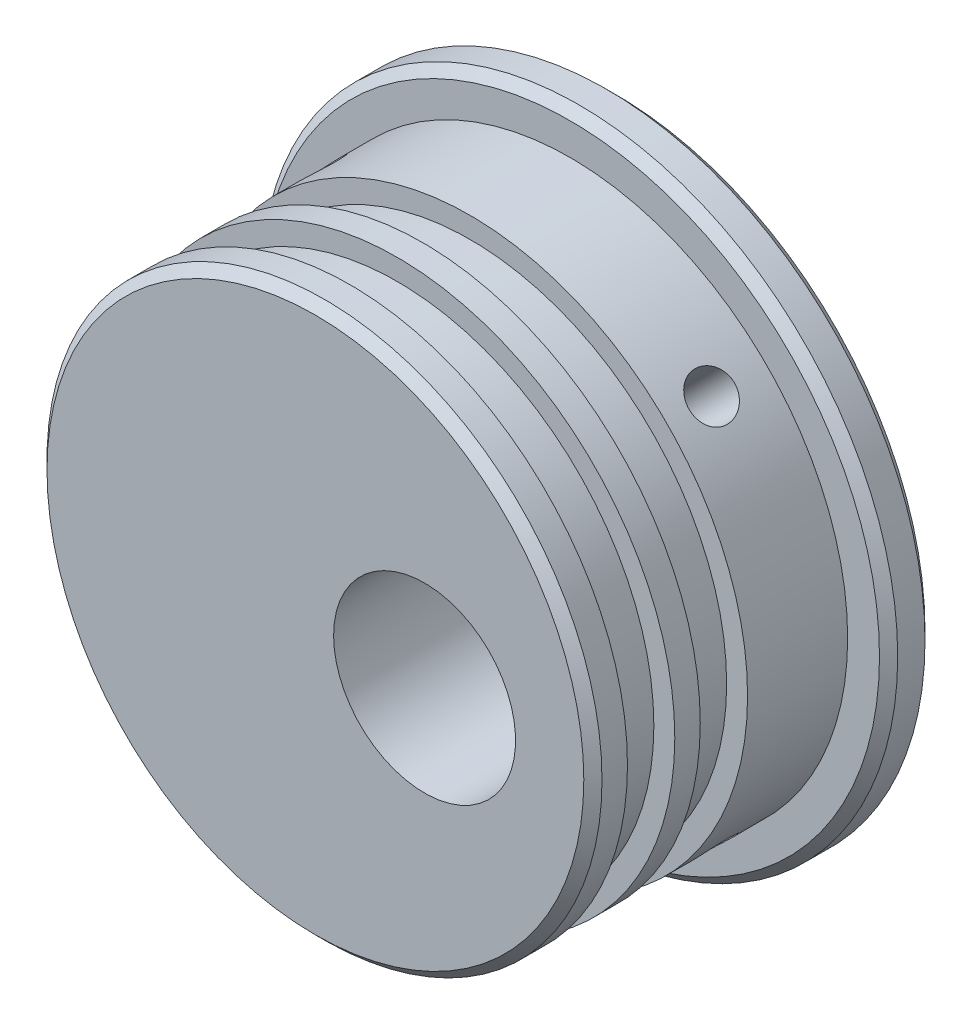
ISO-10303-21;
HEADER;
FILE_DESCRIPTION(('STEP AP214'),'2;1');
FILE_NAME('part.step','',(''),(''),'','','');
FILE_SCHEMA(('AUTOMOTIVE_DESIGN { 1 0 10303 214 1 1 1 1 }'));
ENDSEC;
DATA;
#1=APPLICATION_CONTEXT('core data for automotive mechanical design processes');
#2=APPLICATION_PROTOCOL_DEFINITION('international standard','automotive_design',2000,#1);
#3=PRODUCT_CONTEXT('',#1,'mechanical');
#4=PRODUCT('Part','Part','',(#3));
#5=PRODUCT_RELATED_PRODUCT_CATEGORY('part','',(#4));
#6=PRODUCT_DEFINITION_FORMATION('','',#4);
#7=PRODUCT_DEFINITION_CONTEXT('part definition',#1,'design');
#8=PRODUCT_DEFINITION('design','',#6,#7);
#9=PRODUCT_DEFINITION_SHAPE('','',#8);
#10=(LENGTH_UNIT() NAMED_UNIT(*) SI_UNIT(.MILLI.,.METRE.));
#11=(NAMED_UNIT(*) PLANE_ANGLE_UNIT() SI_UNIT($,.RADIAN.));
#12=(NAMED_UNIT(*) SI_UNIT($,.STERADIAN.) SOLID_ANGLE_UNIT());
#13=UNCERTAINTY_MEASURE_WITH_UNIT(LENGTH_MEASURE(1.E-05),#10,'distance_accuracy_value','');
#14=(GEOMETRIC_REPRESENTATION_CONTEXT(3) GLOBAL_UNCERTAINTY_ASSIGNED_CONTEXT((#13)) GLOBAL_UNIT_ASSIGNED_CONTEXT((#10,
#11,#12)) REPRESENTATION_CONTEXT('',''));
#15=CARTESIAN_POINT('',(0.,0.,0.));
#16=DIRECTION('',(0.,0.,1.));
#17=DIRECTION('',(1.,0.,0.));
#18=AXIS2_PLACEMENT_3D('',#15,#16,#17);
#19=CARTESIAN_POINT('',(0.,0.,14.));
#20=DIRECTION('',(0.,0.,-1.));
#21=DIRECTION('',(-1.,0.,0.));
#22=AXIS2_PLACEMENT_3D('',#19,#20,#21);
#23=CYLINDRICAL_SURFACE('',#22,15.25);
#24=CARTESIAN_POINT('',(0.,0.,0.));
#25=DIRECTION('',(0.,0.,1.));
#26=DIRECTION('',(1.,0.,0.));
#27=AXIS2_PLACEMENT_3D('',#24,#25,#26);
#28=CIRCLE('',#27,15.25);
#29=CARTESIAN_POINT('',(15.25,0.,0.));
#30=VERTEX_POINT('',#29);
#31=EDGE_CURVE('E140',#30,#30,#28,.T.);
#32=ORIENTED_EDGE('',*,*,#31,.T.);
#33=EDGE_LOOP('',(#32));
#34=FACE_BOUND('',#33,.T.);
#35=CARTESIAN_POINT('',(0.,0.,5.5));
#36=DIRECTION('',(0.,0.,1.));
#37=DIRECTION('',(1.,0.,0.));
#38=AXIS2_PLACEMENT_3D('',#35,#36,#37);
#39=CIRCLE('',#38,15.25);
#40=CARTESIAN_POINT('',(15.25,0.,5.5));
#41=VERTEX_POINT('',#40);
#42=EDGE_CURVE('E144',#41,#41,#39,.T.);
#43=ORIENTED_EDGE('',*,*,#42,.F.);
#44=EDGE_LOOP('',(#43));
#45=FACE_BOUND('',#44,.T.);
#46=CARTESIAN_POINT('',(11.6309761065855,9.86320915361913,3.));
#47=CARTESIAN_POINT('',(11.6309744215201,9.86321180087857,2.92991360305348));
#48=CARTESIAN_POINT('',(11.6271405155153,9.86773772011875,2.85977939119693));
#49=CARTESIAN_POINT('',(11.6118741063526,9.88569741000501,2.72145119558452));
#50=CARTESIAN_POINT('',(11.6004329758878,9.89914129442054,2.65325950650436));
#51=CARTESIAN_POINT('',(11.5702000278005,9.93446065307875,2.52083985247226));
#52=CARTESIAN_POINT('',(11.5514123560731,9.95633137167976,2.45660967553571));
#53=CARTESIAN_POINT('',(11.5068971891931,10.0077453892855,2.33390211116577));
#54=CARTESIAN_POINT('',(11.4811711854819,10.0372870393211,2.27542349107885));
#55=CARTESIAN_POINT('',(11.4232797989768,10.1031232118335,2.1657181334001));
#56=CARTESIAN_POINT('',(11.3911003383923,10.1394324849916,2.11450767533015));
#57=CARTESIAN_POINT('',(11.321068820752,10.217565625985,2.02093214410294));
#58=CARTESIAN_POINT('',(11.2832165168327,10.2593897337981,1.97856745607637));
#59=CARTESIAN_POINT('',(11.2026811307694,10.3472695532697,1.90383210916556));
#60=CARTESIAN_POINT('',(11.1599913699655,10.3933310982818,1.8714755030423));
#61=CARTESIAN_POINT('',(11.0708908105767,10.4881889008943,1.81776469729084));
#62=CARTESIAN_POINT('',(11.024480075253,10.5369851119977,1.7964103106572));
#63=CARTESIAN_POINT('',(10.9292665051706,10.6357098302593,1.76535688775954));
#64=CARTESIAN_POINT('',(10.8804693279507,10.6856355217365,1.75563155574531));
#65=CARTESIAN_POINT('',(10.7817296765861,10.7852548717217,1.74803102562128));
#66=CARTESIAN_POINT('',(10.7317872231334,10.8349485344024,1.7501556135834));
#67=CARTESIAN_POINT('',(10.6323124276236,10.9325787972126,1.76617309559805));
#68=CARTESIAN_POINT('',(10.5827793886565,10.98051933083,1.78003771196652));
#69=CARTESIAN_POINT('',(10.4854708907786,11.0734787231221,1.81909772239888));
#70=CARTESIAN_POINT('',(10.4376954481331,11.1184975547612,1.84429322129421));
#71=CARTESIAN_POINT('',(10.3453078042328,11.2045124534979,1.90533134267823));
#72=CARTESIAN_POINT('',(10.3006994476219,11.2455036537089,1.94118664069611));
#73=CARTESIAN_POINT('',(10.2161117146463,11.3224040856958,2.02251735536991));
#74=CARTESIAN_POINT('',(10.1761324290984,11.3583132177706,2.06799296071533));
#75=CARTESIAN_POINT('',(10.1019847087802,11.4243109813386,2.16743280398354));
#76=CARTESIAN_POINT('',(10.0678337078505,11.4543821858119,2.22142161136147));
#77=CARTESIAN_POINT('',(10.0066246508903,11.5078938687928,2.33626965687285));
#78=CARTESIAN_POINT('',(9.9795666004347,11.5313343420889,2.39712890040615));
#79=CARTESIAN_POINT('',(9.93346533584459,11.5710715738726,2.52400743401802));
#80=CARTESIAN_POINT('',(9.91442306490565,11.5873674916886,2.59002733025384));
#81=CARTESIAN_POINT('',(9.88502421569937,11.612457666923,2.7253449290061));
#82=CARTESIAN_POINT('',(9.87466746084485,11.6212520768564,2.79464256485182));
#83=CARTESIAN_POINT('',(9.86302388392707,11.6311357655158,2.93433288586504));
#84=CARTESIAN_POINT('',(9.86171078357702,11.6322473683266,3.00472180219505));
#85=CARTESIAN_POINT('',(9.86813147318954,11.6268008609479,3.14478606317713));
#86=CARTESIAN_POINT('',(9.87586518155354,11.6202428199356,3.21446141425955));
#87=CARTESIAN_POINT('',(9.9000883519537,11.5996120859186,3.35102216448946));
#88=CARTESIAN_POINT('',(9.91656561995631,11.5855498583262,3.41791130959227));
#89=CARTESIAN_POINT('',(9.95769416637095,11.5502189413429,3.54711691691239));
#90=CARTESIAN_POINT('',(9.9823455717449,11.5289501400183,3.60943330808664));
#91=CARTESIAN_POINT('',(10.039046401265,11.4796105156591,3.72788178439302));
#92=CARTESIAN_POINT('',(10.0711127019415,11.4515241683156,3.78399932352413));
#93=CARTESIAN_POINT('',(10.1415396401307,11.3892001043952,3.88831014655002));
#94=CARTESIAN_POINT('',(10.1799003824625,11.354962285379,3.93650329845584));
#95=CARTESIAN_POINT('',(10.2617643849538,11.2810343024912,4.02371453600203));
#96=CARTESIAN_POINT('',(10.3052797792833,11.2413312362467,4.06271029906659));
#97=CARTESIAN_POINT('',(10.3959892271028,11.1574959992806,4.13026667968633));
#98=CARTESIAN_POINT('',(10.4431832448559,11.1133638715852,4.15882739860038));
#99=CARTESIAN_POINT('',(10.5397227948961,11.0218491190926,4.20466458427029));
#100=CARTESIAN_POINT('',(10.5890656111406,10.9744705566265,4.22195487894049));
#101=CARTESIAN_POINT('',(10.6884685778403,10.8776812558851,4.24480560667045));
#102=CARTESIAN_POINT('',(10.7385287151862,10.8282705547171,4.25036625381923));
#103=CARTESIAN_POINT('',(10.8377623151394,10.7289478515367,4.2495973777545));
#104=CARTESIAN_POINT('',(10.8869379463828,10.6790377431088,4.24330265380566));
#105=CARTESIAN_POINT('',(10.9831868410489,10.5800224850005,4.21907425726429));
#106=CARTESIAN_POINT('',(11.0302601015411,10.5309173364421,4.20114056844852));
#107=CARTESIAN_POINT('',(11.1210549230309,10.4349893380085,4.1541520931392));
#108=CARTESIAN_POINT('',(11.1647766628317,10.388166366428,4.12509790041974));
#109=CARTESIAN_POINT('',(11.2477712151842,10.2982469915684,4.05669718835404));
#110=CARTESIAN_POINT('',(11.2870441013903,10.2551505265966,4.01735083943888));
#111=CARTESIAN_POINT('',(11.3603056880614,10.173935296532,3.92935214954373));
#112=CARTESIAN_POINT('',(11.3942792979223,10.135830794534,3.8806740817463));
#113=CARTESIAN_POINT('',(11.4560350430458,10.0659793848153,3.77543969842741));
#114=CARTESIAN_POINT('',(11.4838156757412,10.0342340201651,3.71888147638586));
#115=CARTESIAN_POINT('',(11.5326000250834,9.97812736744317,3.59938589608275));
#116=CARTESIAN_POINT('',(11.5535912772128,9.95377966553389,3.53643708057574));
#117=CARTESIAN_POINT('',(11.5882497728167,9.91340918544415,3.40607366549575));
#118=CARTESIAN_POINT('',(11.6019254487227,9.89737682308845,3.33866430864196));
#119=CARTESIAN_POINT('',(11.6181791134704,9.8782844889429,3.22571344742056));
#120=CARTESIAN_POINT('',(11.6229730126722,9.8726401307849,3.18089867495409));
#121=CARTESIAN_POINT('',(11.6293720505741,9.86510161103692,3.09072928111191));
#122=CARTESIAN_POINT('',(11.6309771975144,9.86320743975589,3.04537466113155));
#123=CARTESIAN_POINT('',(11.6309761065855,9.86320915361913,3.));
#124=B_SPLINE_CURVE_WITH_KNOTS('',3,(#46,#47,#48,#49,#50,#51,#52,#53,#54,#55,#56,#57,#58,#59,
#60,#61,#62,#63,#64,#65,#66,#67,#68,#69,#70,#71,#72,#73,#74,#75,#76,#77,#78,#79,#80,#81,#82,#83,
#84,#85,#86,#87,#88,#89,#90,#91,#92,#93,#94,#95,#96,#97,#98,#99,#100,#101,#102,#103,#104,#105,
#106,#107,#108,#109,#110,#111,#112,#113,#114,#115,#116,#117,#118,#119,#120,#121,#122,#123),
.UNSPECIFIED.,.T.,.F.,(4,2,2,2,2,2,2,2,2,2,2,2,2,2,2,2,2,2,2,2,2,2,2,2,2,2,2,2,2,2,2,2,2,2,2,2,
2,2,4),(0.,0.21009352132337,0.420425715756466,0.630639383716231,0.840807900796242,
1.05143997368959,1.26208121525537,1.47301689808562,1.68394899551014,1.89440322343687,
2.10485365201923,2.31479861521414,2.52474552082472,2.7349430789113,2.94514476012483,
3.1559645863687,3.36678457830843,3.57762936994871,3.78846987475218,3.99869747759377,
4.20892318428145,4.41885647140858,4.62879301940303,4.83921217629779,5.04963483758905,
5.26056306858212,5.4714892507083,5.68215615362665,5.89281921142861,6.10286487007458,
6.31291082149818,6.52294555918085,6.73297681905194,6.94359566979171,7.15426556631034,
7.36532006153524,7.57613075388127,7.71214783260012,7.84816455982973),.UNSPECIFIED.);
#125=CARTESIAN_POINT('',(11.6309761065855,9.86320915361913,3.));
#126=VERTEX_POINT('',#125);
#127=EDGE_CURVE('E66',#126,#126,#124,.T.);
#128=ORIENTED_EDGE('',*,*,#127,.F.);
#129=EDGE_LOOP('',(#128));
#130=FACE_BOUND('',#129,.T.);
#131=CARTESIAN_POINT('',(9.86320915361925,-11.6309761065854,3.));
#132=CARTESIAN_POINT('',(9.86321180087869,-11.63097442152,2.92991360305348));
#133=CARTESIAN_POINT('',(9.86773772011887,-11.6271405155152,2.85977939119693));
#134=CARTESIAN_POINT('',(9.88569741000513,-11.6118741063525,2.72145119558452));
#135=CARTESIAN_POINT('',(9.89914129442066,-11.6004329758877,2.65325950650436));
#136=CARTESIAN_POINT('',(9.93446065307887,-11.5702000278004,2.52083985247226));
#137=CARTESIAN_POINT('',(9.95633137167988,-11.551412356073,2.45660967553571));
#138=CARTESIAN_POINT('',(10.0077453892856,-11.506897189193,2.33390211116577));
#139=CARTESIAN_POINT('',(10.0372870393212,-11.4811711854818,2.27542349107885));
#140=CARTESIAN_POINT('',(10.1031232118336,-11.4232797989767,2.1657181334001));
#141=CARTESIAN_POINT('',(10.1394324849917,-11.3911003383922,2.11450767533015));
#142=CARTESIAN_POINT('',(10.2175656259852,-11.3210688207519,2.02093214410294));
#143=CARTESIAN_POINT('',(10.2593897337982,-11.2832165168326,1.97856745607637));
#144=CARTESIAN_POINT('',(10.3472695532699,-11.2026811307693,1.90383210916556));
#145=CARTESIAN_POINT('',(10.393331098282,-11.1599913699654,1.8714755030423));
#146=CARTESIAN_POINT('',(10.4881889008944,-11.0708908105766,1.81776469729084));
#147=CARTESIAN_POINT('',(10.5369851119978,-11.0244800752529,1.7964103106572));
#148=CARTESIAN_POINT('',(10.6357098302594,-10.9292665051705,1.76535688775954));
#149=CARTESIAN_POINT('',(10.6856355217366,-10.8804693279506,1.75563155574531));
#150=CARTESIAN_POINT('',(10.7852548717219,-10.781729676586,1.74803102562128));
#151=CARTESIAN_POINT('',(10.8349485344025,-10.7317872231333,1.7501556135834));
#152=CARTESIAN_POINT('',(10.9325787972127,-10.6323124276234,1.76617309559805));
#153=CARTESIAN_POINT('',(10.9805193308301,-10.5827793886564,1.78003771196652));
#154=CARTESIAN_POINT('',(11.0734787231222,-10.4854708907785,1.81909772239888));
#155=CARTESIAN_POINT('',(11.1184975547613,-10.437695448133,1.84429322129421));
#156=CARTESIAN_POINT('',(11.204512453498,-10.3453078042327,1.90533134267823));
#157=CARTESIAN_POINT('',(11.245503653709,-10.3006994476218,1.94118664069611));
#158=CARTESIAN_POINT('',(11.3224040856959,-10.2161117146462,2.02251735536991));
#159=CARTESIAN_POINT('',(11.3583132177707,-10.1761324290983,2.06799296071533));
#160=CARTESIAN_POINT('',(11.4243109813387,-10.10198470878,2.16743280398354));
#161=CARTESIAN_POINT('',(11.454382185812,-10.0678337078503,2.22142161136147));
#162=CARTESIAN_POINT('',(11.5078938687929,-10.0066246508902,2.33626965687285));
#163=CARTESIAN_POINT('',(11.531334342089,-9.97956660043458,2.39712890040615));
#164=CARTESIAN_POINT('',(11.5710715738727,-9.93346533584447,2.52400743401802));
#165=CARTESIAN_POINT('',(11.5873674916887,-9.91442306490552,2.59002733025384));
#166=CARTESIAN_POINT('',(11.6124576669231,-9.88502421569925,2.7253449290061));
#167=CARTESIAN_POINT('',(11.6212520768565,-9.87466746084473,2.79464256485182));
#168=CARTESIAN_POINT('',(11.6311357655159,-9.86302388392695,2.93433288586504));
#169=CARTESIAN_POINT('',(11.6322473683267,-9.86171078357689,3.00472180219505));
#170=CARTESIAN_POINT('',(11.626800860948,-9.86813147318941,3.14478606317713));
#171=CARTESIAN_POINT('',(11.6202428199357,-9.87586518155341,3.21446141425955));
#172=CARTESIAN_POINT('',(11.5996120859187,-9.90008835195358,3.35102216448946));
#173=CARTESIAN_POINT('',(11.5855498583263,-9.91656561995619,3.41791130959227));
#174=CARTESIAN_POINT('',(11.550218941343,-9.95769416637083,3.54711691691239));
#175=CARTESIAN_POINT('',(11.5289501400184,-9.98234557174477,3.60943330808664));
#176=CARTESIAN_POINT('',(11.4796105156592,-10.0390464012649,3.72788178439302));
#177=CARTESIAN_POINT('',(11.4515241683157,-10.0711127019414,3.78399932352413));
#178=CARTESIAN_POINT('',(11.3892001043953,-10.1415396401305,3.88831014655002));
#179=CARTESIAN_POINT('',(11.3549622853792,-10.1799003824624,3.93650329845584));
#180=CARTESIAN_POINT('',(11.2810343024913,-10.2617643849537,4.02371453600203));
#181=CARTESIAN_POINT('',(11.2413312362468,-10.3052797792832,4.06271029906659));
#182=CARTESIAN_POINT('',(11.1574959992807,-10.3959892271027,4.13026667968633));
#183=CARTESIAN_POINT('',(11.1133638715853,-10.4431832448558,4.15882739860039));
#184=CARTESIAN_POINT('',(11.0218491190927,-10.539722794896,4.20466458427029));
#185=CARTESIAN_POINT('',(10.9744705566266,-10.5890656111405,4.22195487894049));
#186=CARTESIAN_POINT('',(10.8776812558852,-10.6884685778402,4.24480560667045));
#187=CARTESIAN_POINT('',(10.8282705547172,-10.7385287151861,4.25036625381923));
#188=CARTESIAN_POINT('',(10.7289478515368,-10.8377623151392,4.2495973777545));
#189=CARTESIAN_POINT('',(10.679037743109,-10.8869379463827,4.24330265380566));
#190=CARTESIAN_POINT('',(10.5800224850006,-10.9831868410488,4.21907425726429));
#191=CARTESIAN_POINT('',(10.5309173364422,-11.030260101541,4.20114056844852));
#192=CARTESIAN_POINT('',(10.4349893380087,-11.1210549230307,4.1541520931392));
#193=CARTESIAN_POINT('',(10.3881663664282,-11.1647766628316,4.12509790041974));
#194=CARTESIAN_POINT('',(10.2982469915685,-11.2477712151841,4.05669718835404));
#195=CARTESIAN_POINT('',(10.2551505265967,-11.2870441013901,4.01735083943888));
#196=CARTESIAN_POINT('',(10.1739352965321,-11.3603056880613,3.92935214954373));
#197=CARTESIAN_POINT('',(10.1358307945341,-11.3942792979222,3.8806740817463));
#198=CARTESIAN_POINT('',(10.0659793848154,-11.4560350430457,3.77543969842741));
#199=CARTESIAN_POINT('',(10.0342340201652,-11.4838156757411,3.71888147638586));
#200=CARTESIAN_POINT('',(9.97812736744329,-11.5326000250833,3.59938589608275));
#201=CARTESIAN_POINT('',(9.95377966553401,-11.5535912772127,3.53643708057574));
#202=CARTESIAN_POINT('',(9.91340918544427,-11.5882497728166,3.40607366549575));
#203=CARTESIAN_POINT('',(9.89737682308858,-11.6019254487226,3.33866430864196));
#204=CARTESIAN_POINT('',(9.87828448894303,-11.6181791134703,3.22571344742056));
#205=CARTESIAN_POINT('',(9.87264013078502,-11.6229730126721,3.18089867495409));
#206=CARTESIAN_POINT('',(9.86510161103704,-11.629372050574,3.09072928111191));
#207=CARTESIAN_POINT('',(9.86320743975601,-11.6309771975143,3.04537466113155));
#208=CARTESIAN_POINT('',(9.86320915361925,-11.6309761065854,3.));
#209=B_SPLINE_CURVE_WITH_KNOTS('',3,(#131,#132,#133,#134,#135,#136,#137,#138,#139,#140,#141,
#142,#143,#144,#145,#146,#147,#148,#149,#150,#151,#152,#153,#154,#155,#156,#157,#158,#159,#160,
#161,#162,#163,#164,#165,#166,#167,#168,#169,#170,#171,#172,#173,#174,#175,#176,#177,#178,#179,
#180,#181,#182,#183,#184,#185,#186,#187,#188,#189,#190,#191,#192,#193,#194,#195,#196,#197,#198,
#199,#200,#201,#202,#203,#204,#205,#206,#207,#208),.UNSPECIFIED.,.T.,.F.,(4,2,2,2,2,2,2,2,2,2,2,
2,2,2,2,2,2,2,2,2,2,2,2,2,2,2,2,2,2,2,2,2,2,2,2,2,2,2,4),(0.,0.21009352132337,0.420425715756466,
0.630639383716232,0.840807900796242,1.05143997368959,1.26208121525537,1.47301689808563,
1.68394899551014,1.89440322343688,2.10485365201923,2.31479861521414,2.52474552082472,
2.7349430789113,2.94514476012483,3.1559645863687,3.36678457830843,3.57762936994872,
3.78846987475219,3.99869747759377,4.20892318428145,4.41885647140858,4.62879301940303,
4.8392121762978,5.04963483758905,5.26056306858212,5.4714892507083,5.68215615362665,
5.89281921142862,6.10286487007458,6.31291082149818,6.52294555918085,6.73297681905195,
6.94359566979172,7.15426556631035,7.36532006153524,7.57613075388127,7.71214783260012,
7.84816455982974),.UNSPECIFIED.);
#210=CARTESIAN_POINT('',(9.86320915361925,-11.6309761065854,3.));
#211=VERTEX_POINT('',#210);
#212=EDGE_CURVE('E75',#211,#211,#209,.T.);
#213=ORIENTED_EDGE('',*,*,#212,.F.);
#214=EDGE_LOOP('',(#213));
#215=FACE_BOUND('',#214,.T.);
#216=CARTESIAN_POINT('',(-11.6309761065855,-9.86320915361913,3.));
#217=CARTESIAN_POINT('',(-11.6309744215201,-9.86321180087857,2.92991360305348));
#218=CARTESIAN_POINT('',(-11.6271405155153,-9.86773772011875,2.85977939119693));
#219=CARTESIAN_POINT('',(-11.6118741063526,-9.88569741000501,2.72145119558452));
#220=CARTESIAN_POINT('',(-11.6004329758878,-9.89914129442054,2.65325950650436));
#221=CARTESIAN_POINT('',(-11.5702000278005,-9.93446065307875,2.52083985247226));
#222=CARTESIAN_POINT('',(-11.5514123560731,-9.95633137167976,2.45660967553571));
#223=CARTESIAN_POINT('',(-11.5068971891931,-10.0077453892855,2.33390211116577));
#224=CARTESIAN_POINT('',(-11.4811711854819,-10.0372870393211,2.27542349107885));
#225=CARTESIAN_POINT('',(-11.4232797989768,-10.1031232118335,2.1657181334001));
#226=CARTESIAN_POINT('',(-11.3911003383923,-10.1394324849916,2.11450767533015));
#227=CARTESIAN_POINT('',(-11.321068820752,-10.217565625985,2.02093214410294));
#228=CARTESIAN_POINT('',(-11.2832165168327,-10.2593897337981,1.97856745607637));
#229=CARTESIAN_POINT('',(-11.2026811307694,-10.3472695532697,1.90383210916556));
#230=CARTESIAN_POINT('',(-11.1599913699655,-10.3933310982818,1.8714755030423));
#231=CARTESIAN_POINT('',(-11.0708908105767,-10.4881889008943,1.81776469729084));
#232=CARTESIAN_POINT('',(-11.024480075253,-10.5369851119977,1.7964103106572));
#233=CARTESIAN_POINT('',(-10.9292665051706,-10.6357098302593,1.76535688775954));
#234=CARTESIAN_POINT('',(-10.8804693279507,-10.6856355217365,1.75563155574531));
#235=CARTESIAN_POINT('',(-10.7817296765861,-10.7852548717217,1.74803102562128));
#236=CARTESIAN_POINT('',(-10.7317872231334,-10.8349485344024,1.7501556135834));
#237=CARTESIAN_POINT('',(-10.6323124276236,-10.9325787972126,1.76617309559805));
#238=CARTESIAN_POINT('',(-10.5827793886565,-10.98051933083,1.78003771196652));
#239=CARTESIAN_POINT('',(-10.4854708907786,-11.0734787231221,1.81909772239888));
#240=CARTESIAN_POINT('',(-10.4376954481331,-11.1184975547612,1.84429322129421));
#241=CARTESIAN_POINT('',(-10.3453078042328,-11.2045124534979,1.90533134267823));
#242=CARTESIAN_POINT('',(-10.3006994476219,-11.2455036537089,1.94118664069611));
#243=CARTESIAN_POINT('',(-10.2161117146463,-11.3224040856958,2.02251735536991));
#244=CARTESIAN_POINT('',(-10.1761324290984,-11.3583132177706,2.06799296071533));
#245=CARTESIAN_POINT('',(-10.1019847087802,-11.4243109813386,2.16743280398354));
#246=CARTESIAN_POINT('',(-10.0678337078505,-11.4543821858119,2.22142161136147));
#247=CARTESIAN_POINT('',(-10.0066246508903,-11.5078938687928,2.33626965687285));
#248=CARTESIAN_POINT('',(-9.9795666004347,-11.5313343420889,2.39712890040615));
#249=CARTESIAN_POINT('',(-9.93346533584459,-11.5710715738726,2.52400743401802));
#250=CARTESIAN_POINT('',(-9.91442306490565,-11.5873674916886,2.59002733025384));
#251=CARTESIAN_POINT('',(-9.88502421569937,-11.612457666923,2.7253449290061));
#252=CARTESIAN_POINT('',(-9.87466746084485,-11.6212520768564,2.79464256485182));
#253=CARTESIAN_POINT('',(-9.86302388392707,-11.6311357655158,2.93433288586504));
#254=CARTESIAN_POINT('',(-9.86171078357702,-11.6322473683266,3.00472180219505));
#255=CARTESIAN_POINT('',(-9.86813147318954,-11.6268008609479,3.14478606317713));
#256=CARTESIAN_POINT('',(-9.87586518155354,-11.6202428199356,3.21446141425955));
#257=CARTESIAN_POINT('',(-9.9000883519537,-11.5996120859186,3.35102216448946));
#258=CARTESIAN_POINT('',(-9.91656561995631,-11.5855498583262,3.41791130959227));
#259=CARTESIAN_POINT('',(-9.95769416637095,-11.5502189413429,3.54711691691239));
#260=CARTESIAN_POINT('',(-9.9823455717449,-11.5289501400183,3.60943330808664));
#261=CARTESIAN_POINT('',(-10.039046401265,-11.4796105156591,3.72788178439302));
#262=CARTESIAN_POINT('',(-10.0711127019415,-11.4515241683156,3.78399932352413));
#263=CARTESIAN_POINT('',(-10.1415396401307,-11.3892001043952,3.88831014655002));
#264=CARTESIAN_POINT('',(-10.1799003824625,-11.354962285379,3.93650329845584));
#265=CARTESIAN_POINT('',(-10.2617643849538,-11.2810343024912,4.02371453600203));
#266=CARTESIAN_POINT('',(-10.3052797792833,-11.2413312362467,4.06271029906659));
#267=CARTESIAN_POINT('',(-10.3959892271028,-11.1574959992806,4.13026667968633));
#268=CARTESIAN_POINT('',(-10.4431832448559,-11.1133638715852,4.15882739860038));
#269=CARTESIAN_POINT('',(-10.5397227948961,-11.0218491190926,4.20466458427029));
#270=CARTESIAN_POINT('',(-10.5890656111406,-10.9744705566265,4.22195487894049));
#271=CARTESIAN_POINT('',(-10.6884685778403,-10.8776812558851,4.24480560667045));
#272=CARTESIAN_POINT('',(-10.7385287151862,-10.8282705547171,4.25036625381923));
#273=CARTESIAN_POINT('',(-10.8377623151394,-10.7289478515367,4.2495973777545));
#274=CARTESIAN_POINT('',(-10.8869379463828,-10.6790377431088,4.24330265380566));
#275=CARTESIAN_POINT('',(-10.9831868410489,-10.5800224850005,4.21907425726429));
#276=CARTESIAN_POINT('',(-11.0302601015411,-10.5309173364421,4.20114056844852));
#277=CARTESIAN_POINT('',(-11.1210549230309,-10.4349893380085,4.1541520931392));
#278=CARTESIAN_POINT('',(-11.1647766628317,-10.388166366428,4.12509790041974));
#279=CARTESIAN_POINT('',(-11.2477712151842,-10.2982469915684,4.05669718835404));
#280=CARTESIAN_POINT('',(-11.2870441013903,-10.2551505265966,4.01735083943888));
#281=CARTESIAN_POINT('',(-11.3603056880614,-10.173935296532,3.92935214954373));
#282=CARTESIAN_POINT('',(-11.3942792979223,-10.135830794534,3.8806740817463));
#283=CARTESIAN_POINT('',(-11.4560350430458,-10.0659793848153,3.77543969842741));
#284=CARTESIAN_POINT('',(-11.4838156757412,-10.0342340201651,3.71888147638586));
#285=CARTESIAN_POINT('',(-11.5326000250834,-9.97812736744317,3.59938589608275));
#286=CARTESIAN_POINT('',(-11.5535912772128,-9.95377966553389,3.53643708057574));
#287=CARTESIAN_POINT('',(-11.5882497728167,-9.91340918544415,3.40607366549575));
#288=CARTESIAN_POINT('',(-11.6019254487227,-9.89737682308845,3.33866430864196));
#289=CARTESIAN_POINT('',(-11.6181791134704,-9.8782844889429,3.22571344742056));
#290=CARTESIAN_POINT('',(-11.6229730126722,-9.8726401307849,3.18089867495409));
#291=CARTESIAN_POINT('',(-11.6293720505741,-9.86510161103692,3.09072928111191));
#292=CARTESIAN_POINT('',(-11.6309771975144,-9.86320743975589,3.04537466113155));
#293=CARTESIAN_POINT('',(-11.6309761065855,-9.86320915361913,3.));
#294=B_SPLINE_CURVE_WITH_KNOTS('',3,(#216,#217,#218,#219,#220,#221,#222,#223,#224,#225,#226,
#227,#228,#229,#230,#231,#232,#233,#234,#235,#236,#237,#238,#239,#240,#241,#242,#243,#244,#245,
#246,#247,#248,#249,#250,#251,#252,#253,#254,#255,#256,#257,#258,#259,#260,#261,#262,#263,#264,
#265,#266,#267,#268,#269,#270,#271,#272,#273,#274,#275,#276,#277,#278,#279,#280,#281,#282,#283,
#284,#285,#286,#287,#288,#289,#290,#291,#292,#293),.UNSPECIFIED.,.T.,.F.,(4,2,2,2,2,2,2,2,2,2,2,
2,2,2,2,2,2,2,2,2,2,2,2,2,2,2,2,2,2,2,2,2,2,2,2,2,2,2,4),(0.,0.21009352132337,0.420425715756466,
0.630639383716231,0.840807900796242,1.05143997368959,1.26208121525537,1.47301689808562,
1.68394899551014,1.89440322343687,2.10485365201923,2.31479861521414,2.52474552082472,
2.7349430789113,2.94514476012483,3.1559645863687,3.36678457830843,3.57762936994871,
3.78846987475218,3.99869747759377,4.20892318428145,4.41885647140858,4.62879301940303,
4.83921217629779,5.04963483758905,5.26056306858212,5.4714892507083,5.68215615362665,
5.89281921142861,6.10286487007458,6.31291082149818,6.52294555918085,6.73297681905194,
6.94359566979171,7.15426556631034,7.36532006153524,7.57613075388127,7.71214783260012,
7.84816455982973),.UNSPECIFIED.);
#295=CARTESIAN_POINT('',(-11.6309761065855,-9.86320915361913,3.));
#296=VERTEX_POINT('',#295);
#297=EDGE_CURVE('E153',#296,#296,#294,.T.);
#298=ORIENTED_EDGE('',*,*,#297,.F.);
#299=EDGE_LOOP('',(#298));
#300=FACE_BOUND('',#299,.T.);
#301=CARTESIAN_POINT('',(-9.86320915361917,11.6309761065855,3.));
#302=CARTESIAN_POINT('',(-9.86321180087861,11.63097442152,2.92991360305348));
#303=CARTESIAN_POINT('',(-9.86773772011879,11.6271405155153,2.85977939119693));
#304=CARTESIAN_POINT('',(-9.88569741000505,11.6118741063526,2.72145119558452));
#305=CARTESIAN_POINT('',(-9.89914129442058,11.6004329758878,2.65325950650436));
#306=CARTESIAN_POINT('',(-9.93446065307879,11.5702000278005,2.52083985247226));
#307=CARTESIAN_POINT('',(-9.9563313716798,11.5514123560731,2.45660967553571));
#308=CARTESIAN_POINT('',(-10.0077453892855,11.5068971891931,2.33390211116577));
#309=CARTESIAN_POINT('',(-10.0372870393211,11.4811711854818,2.27542349107885));
#310=CARTESIAN_POINT('',(-10.1031232118335,11.4232797989768,2.1657181334001));
#311=CARTESIAN_POINT('',(-10.1394324849917,11.3911003383923,2.11450767533015));
#312=CARTESIAN_POINT('',(-10.2175656259851,11.3210688207519,2.02093214410294));
#313=CARTESIAN_POINT('',(-10.2593897337982,11.2832165168327,1.97856745607637));
#314=CARTESIAN_POINT('',(-10.3472695532698,11.2026811307694,1.90383210916556));
#315=CARTESIAN_POINT('',(-10.3933310982819,11.1599913699654,1.8714755030423));
#316=CARTESIAN_POINT('',(-10.4881889008943,11.0708908105766,1.81776469729084));
#317=CARTESIAN_POINT('',(-10.5369851119977,11.024480075253,1.7964103106572));
#318=CARTESIAN_POINT('',(-10.6357098302593,10.9292665051706,1.76535688775954));
#319=CARTESIAN_POINT('',(-10.6856355217365,10.8804693279507,1.75563155574531));
#320=CARTESIAN_POINT('',(-10.7852548717218,10.7817296765861,1.74803102562128));
#321=CARTESIAN_POINT('',(-10.8349485344024,10.7317872231334,1.7501556135834));
#322=CARTESIAN_POINT('',(-10.9325787972126,10.6323124276235,1.76617309559805));
#323=CARTESIAN_POINT('',(-10.9805193308301,10.5827793886565,1.78003771196652));
#324=CARTESIAN_POINT('',(-11.0734787231221,10.4854708907786,1.81909772239888));
#325=CARTESIAN_POINT('',(-11.1184975547612,10.4376954481331,1.84429322129421));
#326=CARTESIAN_POINT('',(-11.204512453498,10.3453078042328,1.90533134267823));
#327=CARTESIAN_POINT('',(-11.245503653709,10.3006994476219,1.94118664069611));
#328=CARTESIAN_POINT('',(-11.3224040856958,10.2161117146463,2.02251735536991));
#329=CARTESIAN_POINT('',(-11.3583132177706,10.1761324290984,2.06799296071533));
#330=CARTESIAN_POINT('',(-11.4243109813387,10.1019847087801,2.16743280398354));
#331=CARTESIAN_POINT('',(-11.4543821858119,10.0678337078504,2.22142161136147));
#332=CARTESIAN_POINT('',(-11.5078938687928,10.0066246508903,2.33626965687285));
#333=CARTESIAN_POINT('',(-11.5313343420889,9.97956660043466,2.39712890040615));
#334=CARTESIAN_POINT('',(-11.5710715738726,9.93346533584455,2.52400743401802));
#335=CARTESIAN_POINT('',(-11.5873674916886,9.91442306490561,2.59002733025384));
#336=CARTESIAN_POINT('',(-11.6124576669231,9.88502421569933,2.7253449290061));
#337=CARTESIAN_POINT('',(-11.6212520768564,9.87466746084482,2.79464256485182));
#338=CARTESIAN_POINT('',(-11.6311357655159,9.86302388392703,2.93433288586504));
#339=CARTESIAN_POINT('',(-11.6322473683266,9.86171078357698,3.00472180219505));
#340=CARTESIAN_POINT('',(-11.626800860948,9.8681314731895,3.14478606317713));
#341=CARTESIAN_POINT('',(-11.6202428199357,9.87586518155349,3.21446141425955));
#342=CARTESIAN_POINT('',(-11.5996120859186,9.90008835195366,3.35102216448946));
#343=CARTESIAN_POINT('',(-11.5855498583262,9.91656561995627,3.41791130959227));
#344=CARTESIAN_POINT('',(-11.550218941343,9.95769416637092,3.54711691691239));
#345=CARTESIAN_POINT('',(-11.5289501400184,9.98234557174486,3.60943330808664));
#346=CARTESIAN_POINT('',(-11.4796105156592,10.039046401265,3.72788178439302));
#347=CARTESIAN_POINT('',(-11.4515241683156,10.0711127019415,3.78399932352413));
#348=CARTESIAN_POINT('',(-11.3892001043952,10.1415396401306,3.88831014655002));
#349=CARTESIAN_POINT('',(-11.3549622853791,10.1799003824625,3.93650329845584));
#350=CARTESIAN_POINT('',(-11.2810343024913,10.2617643849538,4.02371453600203));
#351=CARTESIAN_POINT('',(-11.2413312362467,10.3052797792833,4.06271029906659));
#352=CARTESIAN_POINT('',(-11.1574959992806,10.3959892271028,4.13026667968632));
#353=CARTESIAN_POINT('',(-11.1133638715852,10.4431832448558,4.15882739860038));
#354=CARTESIAN_POINT('',(-11.0218491190927,10.5397227948961,4.20466458427029));
#355=CARTESIAN_POINT('',(-10.9744705566265,10.5890656111406,4.22195487894049));
#356=CARTESIAN_POINT('',(-10.8776812558851,10.6884685778403,4.24480560667045));
#357=CARTESIAN_POINT('',(-10.8282705547171,10.7385287151862,4.25036625381923));
#358=CARTESIAN_POINT('',(-10.7289478515367,10.8377623151393,4.2495973777545));
#359=CARTESIAN_POINT('',(-10.6790377431089,10.8869379463827,4.24330265380566));
#360=CARTESIAN_POINT('',(-10.5800224850005,10.9831868410489,4.21907425726429));
#361=CARTESIAN_POINT('',(-10.5309173364422,11.0302601015411,4.20114056844852));
#362=CARTESIAN_POINT('',(-10.4349893380086,11.1210549230308,4.1541520931392));
#363=CARTESIAN_POINT('',(-10.3881663664281,11.1647766628317,4.12509790041974));
#364=CARTESIAN_POINT('',(-10.2982469915684,11.2477712151841,4.05669718835404));
#365=CARTESIAN_POINT('',(-10.2551505265966,11.2870441013902,4.01735083943888));
#366=CARTESIAN_POINT('',(-10.173935296532,11.3603056880614,3.92935214954373));
#367=CARTESIAN_POINT('',(-10.1358307945341,11.3942792979223,3.8806740817463));
#368=CARTESIAN_POINT('',(-10.0659793848153,11.4560350430457,3.77543969842741));
#369=CARTESIAN_POINT('',(-10.0342340201651,11.4838156757412,3.71888147638586));
#370=CARTESIAN_POINT('',(-9.97812736744321,11.5326000250833,3.59938589608275));
#371=CARTESIAN_POINT('',(-9.95377966553393,11.5535912772128,3.53643708057574));
#372=CARTESIAN_POINT('',(-9.91340918544419,11.5882497728167,3.40607366549575));
#373=CARTESIAN_POINT('',(-9.89737682308849,11.6019254487226,3.33866430864196));
#374=CARTESIAN_POINT('',(-9.87828448894294,11.6181791134704,3.22571344742056));
#375=CARTESIAN_POINT('',(-9.87264013078494,11.6229730126721,3.18089867495409));
#376=CARTESIAN_POINT('',(-9.86510161103696,11.629372050574,3.09072928111191));
#377=CARTESIAN_POINT('',(-9.86320743975593,11.6309771975144,3.04537466113155));
#378=CARTESIAN_POINT('',(-9.86320915361917,11.6309761065855,3.));
#379=B_SPLINE_CURVE_WITH_KNOTS('',3,(#301,#302,#303,#304,#305,#306,#307,#308,#309,#310,#311,
#312,#313,#314,#315,#316,#317,#318,#319,#320,#321,#322,#323,#324,#325,#326,#327,#328,#329,#330,
#331,#332,#333,#334,#335,#336,#337,#338,#339,#340,#341,#342,#343,#344,#345,#346,#347,#348,#349,
#350,#351,#352,#353,#354,#355,#356,#357,#358,#359,#360,#361,#362,#363,#364,#365,#366,#367,#368,
#369,#370,#371,#372,#373,#374,#375,#376,#377,#378),.UNSPECIFIED.,.T.,.F.,(4,2,2,2,2,2,2,2,2,2,2,
2,2,2,2,2,2,2,2,2,2,2,2,2,2,2,2,2,2,2,2,2,2,2,2,2,2,2,4),(0.,0.210093521323371,
0.420425715756465,0.63063938371623,0.84080790079624,1.05143997368959,1.26208121525537,
1.47301689808562,1.68394899551014,1.89440322343688,2.10485365201923,2.31479861521414,
2.52474552082472,2.7349430789113,2.94514476012483,3.1559645863687,3.36678457830843,
3.57762936994871,3.78846987475218,3.99869747759377,4.20892318428145,4.41885647140858,
4.62879301940303,4.8392121762978,5.04963483758905,5.26056306858212,5.4714892507083,
5.68215615362665,5.89281921142861,6.10286487007458,6.31291082149818,6.52294555918085,
6.73297681905195,6.94359566979172,7.15426556631034,7.36532006153524,7.57613075388127,
7.71214783260012,7.84816455982974),.UNSPECIFIED.);
#380=CARTESIAN_POINT('',(-9.86320915361917,11.6309761065855,3.));
#381=VERTEX_POINT('',#380);
#382=EDGE_CURVE('E48',#381,#381,#379,.T.);
#383=ORIENTED_EDGE('',*,*,#382,.F.);
#384=EDGE_LOOP('',(#383));
#385=FACE_BOUND('',#384,.T.);
#386=ADVANCED_FACE('F43',(#34,#45,#130,#215,#300,#385),#23,.T.);
#387=CARTESIAN_POINT('',(0.,0.,8.1));
#388=DIRECTION('',(0.,0.,1.));
#389=DIRECTION('',(1.,0.,0.));
#390=AXIS2_PLACEMENT_3D('',#387,#388,#389);
#391=CIRCLE('',#390,15.25);
#392=CARTESIAN_POINT('',(15.25,0.,8.1));
#393=VERTEX_POINT('',#392);
#394=EDGE_CURVE('E213',#393,#393,#391,.T.);
#395=ORIENTED_EDGE('',*,*,#394,.T.);
#396=EDGE_LOOP('',(#395));
#397=FACE_BOUND('',#396,.T.);
#398=CARTESIAN_POINT('',(0.,0.,9.5));
#399=DIRECTION('',(0.,0.,1.));
#400=DIRECTION('',(1.,0.,0.));
#401=AXIS2_PLACEMENT_3D('',#398,#399,#400);
#402=CIRCLE('',#401,15.25);
#403=CARTESIAN_POINT('',(15.25,0.,9.5));
#404=VERTEX_POINT('',#403);
#405=EDGE_CURVE('E202',#404,#404,#402,.T.);
#406=ORIENTED_EDGE('',*,*,#405,.F.);
#407=EDGE_LOOP('',(#406));
#408=FACE_BOUND('',#407,.T.);
#409=ADVANCED_FACE('F127',(#397,#408),#23,.T.);
#410=CARTESIAN_POINT('',(0.,0.,-2.5));
#411=DIRECTION('',(0.,0.,1.));
#412=DIRECTION('',(1.,0.,0.));
#413=AXIS2_PLACEMENT_3D('',#410,#411,#412);
#414=CYLINDRICAL_SURFACE('',#413,17.5);
#415=CARTESIAN_POINT('',(0.,0.,-0.500000000000004));
#416=DIRECTION('',(0.,0.,1.));
#417=DIRECTION('',(1.,0.,0.));
#418=AXIS2_PLACEMENT_3D('',#415,#416,#417);
#419=CIRCLE('',#418,17.5);
#420=CARTESIAN_POINT('',(17.5,0.,-0.500000000000004));
#421=VERTEX_POINT('',#420);
#422=EDGE_CURVE('E226',#421,#421,#419,.F.);
#423=ORIENTED_EDGE('',*,*,#422,.T.);
#424=EDGE_LOOP('',(#423));
#425=FACE_BOUND('',#424,.T.);
#426=CARTESIAN_POINT('',(0.,0.,-1.99999999999999));
#427=DIRECTION('',(0.,0.,1.));
#428=DIRECTION('',(1.,0.,0.));
#429=AXIS2_PLACEMENT_3D('',#426,#427,#428);
#430=CIRCLE('',#429,17.5);
#431=CARTESIAN_POINT('',(17.5,0.,-1.99999999999999));
#432=VERTEX_POINT('',#431);
#433=EDGE_CURVE('E223',#432,#432,#430,.T.);
#434=ORIENTED_EDGE('',*,*,#433,.T.);
#435=EDGE_LOOP('',(#434));
#436=FACE_BOUND('',#435,.T.);
#437=ADVANCED_FACE('F135',(#425,#436),#414,.T.);
#438=CARTESIAN_POINT('',(0.,0.,-2.5));
#439=DIRECTION('',(0.,0.,1.));
#440=DIRECTION('',(1.,0.,0.));
#441=AXIS2_PLACEMENT_3D('',#438,#439,#440);
#442=PLANE('',#441);
#443=CARTESIAN_POINT('',(6.,0.,-2.5));
#444=DIRECTION('',(0.,0.,-1.));
#445=DIRECTION('',(-1.,0.,0.));
#446=AXIS2_PLACEMENT_3D('',#443,#444,#445);
#447=CIRCLE('',#446,5.);
#448=CARTESIAN_POINT('',(1.,0.,-2.5));
#449=VERTEX_POINT('',#448);
#450=EDGE_CURVE('E73',#449,#449,#447,.T.);
#451=ORIENTED_EDGE('',*,*,#450,.F.);
#452=EDGE_LOOP('',(#451));
#453=FACE_BOUND('',#452,.T.);
#454=CARTESIAN_POINT('',(0.,0.,-2.5));
#455=DIRECTION('',(0.,0.,1.));
#456=DIRECTION('',(1.,0.,0.));
#457=AXIS2_PLACEMENT_3D('',#454,#455,#456);
#458=CIRCLE('',#457,17.);
#459=CARTESIAN_POINT('',(17.,0.,-2.5));
#460=VERTEX_POINT('',#459);
#461=EDGE_CURVE('E10',#460,#460,#458,.F.);
#462=ORIENTED_EDGE('',*,*,#461,.T.);
#463=EDGE_LOOP('',(#462));
#464=FACE_BOUND('',#463,.T.);
#465=ADVANCED_FACE('F251',(#453,#464),#442,.F.);
#466=CARTESIAN_POINT('',(0.,0.,0.));
#467=DIRECTION('',(0.,0.,1.));
#468=DIRECTION('',(1.,0.,0.));
#469=AXIS2_PLACEMENT_3D('',#466,#467,#468);
#470=PLANE('',#469);
#471=CARTESIAN_POINT('',(0.,0.,0.));
#472=DIRECTION('',(0.,0.,1.));
#473=DIRECTION('',(1.,0.,0.));
#474=AXIS2_PLACEMENT_3D('',#471,#472,#473);
#475=CIRCLE('',#474,17.);
#476=CARTESIAN_POINT('',(17.,0.,0.));
#477=VERTEX_POINT('',#476);
#478=EDGE_CURVE('E220',#477,#477,#475,.T.);
#479=ORIENTED_EDGE('',*,*,#478,.T.);
#480=EDGE_LOOP('',(#479));
#481=FACE_BOUND('',#480,.T.);
#482=ORIENTED_EDGE('',*,*,#31,.F.);
#483=EDGE_LOOP('',(#482));
#484=FACE_BOUND('',#483,.T.);
#485=ADVANCED_FACE('F118',(#481,#484),#470,.T.);
#486=CARTESIAN_POINT('',(0.,0.,8.1));
#487=DIRECTION('',(0.,0.,-1.));
#488=DIRECTION('',(-1.,0.,0.));
#489=AXIS2_PLACEMENT_3D('',#486,#487,#488);
#490=CYLINDRICAL_SURFACE('',#489,14.1);
#491=CARTESIAN_POINT('',(0.,0.,8.1));
#492=DIRECTION('',(0.,0.,1.));
#493=DIRECTION('',(1.,0.,0.));
#494=AXIS2_PLACEMENT_3D('',#491,#492,#493);
#495=CIRCLE('',#494,14.1);
#496=CARTESIAN_POINT('',(14.1,0.,8.1));
#497=VERTEX_POINT('',#496);
#498=EDGE_CURVE('E210',#497,#497,#495,.T.);
#499=ORIENTED_EDGE('',*,*,#498,.F.);
#500=EDGE_LOOP('',(#499));
#501=FACE_BOUND('',#500,.T.);
#502=CARTESIAN_POINT('',(0.,0.,5.5));
#503=DIRECTION('',(0.,0.,1.));
#504=DIRECTION('',(1.,0.,0.));
#505=AXIS2_PLACEMENT_3D('',#502,#503,#504);
#506=CIRCLE('',#505,14.1);
#507=CARTESIAN_POINT('',(14.1,0.,5.5));
#508=VERTEX_POINT('',#507);
#509=EDGE_CURVE('E205',#508,#508,#506,.T.);
#510=ORIENTED_EDGE('',*,*,#509,.T.);
#511=EDGE_LOOP('',(#510));
#512=FACE_BOUND('',#511,.T.);
#513=ADVANCED_FACE('F112',(#501,#512),#490,.T.);
#514=CARTESIAN_POINT('',(0.,0.,8.1));
#515=DIRECTION('',(0.,0.,1.));
#516=DIRECTION('',(1.,0.,0.));
#517=AXIS2_PLACEMENT_3D('',#514,#515,#516);
#518=PLANE('',#517);
#519=ORIENTED_EDGE('',*,*,#498,.T.);
#520=EDGE_LOOP('',(#519));
#521=FACE_BOUND('',#520,.T.);
#522=ORIENTED_EDGE('',*,*,#394,.F.);
#523=EDGE_LOOP('',(#522));
#524=FACE_BOUND('',#523,.T.);
#525=ADVANCED_FACE('F109',(#521,#524),#518,.F.);
#526=CARTESIAN_POINT('',(0.,0.,5.5));
#527=DIRECTION('',(0.,0.,1.));
#528=DIRECTION('',(1.,0.,0.));
#529=AXIS2_PLACEMENT_3D('',#526,#527,#528);
#530=PLANE('',#529);
#531=ORIENTED_EDGE('',*,*,#509,.F.);
#532=EDGE_LOOP('',(#531));
#533=FACE_BOUND('',#532,.T.);
#534=ORIENTED_EDGE('',*,*,#42,.T.);
#535=EDGE_LOOP('',(#534));
#536=FACE_BOUND('',#535,.T.);
#537=ADVANCED_FACE('F107',(#533,#536),#530,.T.);
#538=CARTESIAN_POINT('',(0.,0.,12.1));
#539=DIRECTION('',(0.,0.,-1.));
#540=DIRECTION('',(-1.,0.,0.));
#541=AXIS2_PLACEMENT_3D('',#538,#539,#540);
#542=CYLINDRICAL_SURFACE('',#541,14.1);
#543=CARTESIAN_POINT('',(0.,0.,12.1));
#544=DIRECTION('',(0.,0.,1.));
#545=DIRECTION('',(1.,0.,0.));
#546=AXIS2_PLACEMENT_3D('',#543,#544,#545);
#547=CIRCLE('',#546,14.1);
#548=CARTESIAN_POINT('',(14.1,0.,12.1));
#549=VERTEX_POINT('',#548);
#550=EDGE_CURVE('E198',#549,#549,#547,.T.);
#551=ORIENTED_EDGE('',*,*,#550,.F.);
#552=EDGE_LOOP('',(#551));
#553=FACE_BOUND('',#552,.T.);
#554=CARTESIAN_POINT('',(0.,0.,9.5));
#555=DIRECTION('',(0.,0.,1.));
#556=DIRECTION('',(1.,0.,0.));
#557=AXIS2_PLACEMENT_3D('',#554,#555,#556);
#558=CIRCLE('',#557,14.1);
#559=CARTESIAN_POINT('',(14.1,0.,9.5));
#560=VERTEX_POINT('',#559);
#561=EDGE_CURVE('E195',#560,#560,#558,.T.);
#562=ORIENTED_EDGE('',*,*,#561,.T.);
#563=EDGE_LOOP('',(#562));
#564=FACE_BOUND('',#563,.T.);
#565=ADVANCED_FACE('F99',(#553,#564),#542,.T.);
#566=CARTESIAN_POINT('',(0.,0.,12.1));
#567=DIRECTION('',(0.,0.,1.));
#568=DIRECTION('',(1.,0.,0.));
#569=AXIS2_PLACEMENT_3D('',#566,#567,#568);
#570=PLANE('',#569);
#571=ORIENTED_EDGE('',*,*,#550,.T.);
#572=EDGE_LOOP('',(#571));
#573=FACE_BOUND('',#572,.T.);
#574=CARTESIAN_POINT('',(0.,0.,12.1));
#575=DIRECTION('',(0.,0.,1.));
#576=DIRECTION('',(1.,0.,0.));
#577=AXIS2_PLACEMENT_3D('',#574,#575,#576);
#578=CIRCLE('',#577,15.25);
#579=CARTESIAN_POINT('',(15.25,0.,12.1));
#580=VERTEX_POINT('',#579);
#581=EDGE_CURVE('E201',#580,#580,#578,.T.);
#582=ORIENTED_EDGE('',*,*,#581,.F.);
#583=EDGE_LOOP('',(#582));
#584=FACE_BOUND('',#583,.T.);
#585=ADVANCED_FACE('F95',(#573,#584),#570,.F.);
#586=CARTESIAN_POINT('',(0.,0.,9.5));
#587=DIRECTION('',(0.,0.,1.));
#588=DIRECTION('',(1.,0.,0.));
#589=AXIS2_PLACEMENT_3D('',#586,#587,#588);
#590=PLANE('',#589);
#591=ORIENTED_EDGE('',*,*,#561,.F.);
#592=EDGE_LOOP('',(#591));
#593=FACE_BOUND('',#592,.T.);
#594=ORIENTED_EDGE('',*,*,#405,.T.);
#595=EDGE_LOOP('',(#594));
#596=FACE_BOUND('',#595,.T.);
#597=ADVANCED_FACE('F98',(#593,#596),#590,.T.);
#598=CARTESIAN_POINT('',(0.,0.,14.));
#599=DIRECTION('',(0.,0.,1.));
#600=DIRECTION('',(1.,0.,0.));
#601=AXIS2_PLACEMENT_3D('',#598,#599,#600);
#602=PLANE('',#601);
#603=CARTESIAN_POINT('',(6.,0.,14.));
#604=DIRECTION('',(0.,0.,-1.));
#605=DIRECTION('',(-1.,0.,0.));
#606=AXIS2_PLACEMENT_3D('',#603,#604,#605);
#607=CIRCLE('',#606,5.);
#608=CARTESIAN_POINT('',(1.,0.,14.));
#609=VERTEX_POINT('',#608);
#610=EDGE_CURVE('E193',#609,#609,#607,.T.);
#611=ORIENTED_EDGE('',*,*,#610,.T.);
#612=EDGE_LOOP('',(#611));
#613=FACE_BOUND('',#612,.T.);
#614=CARTESIAN_POINT('',(0.,0.,14.));
#615=DIRECTION('',(0.,0.,1.));
#616=DIRECTION('',(1.,0.,0.));
#617=AXIS2_PLACEMENT_3D('',#614,#615,#616);
#618=CIRCLE('',#617,14.75);
#619=CARTESIAN_POINT('',(14.75,0.,14.));
#620=VERTEX_POINT('',#619);
#621=EDGE_CURVE('E62',#620,#620,#618,.T.);
#622=ORIENTED_EDGE('',*,*,#621,.T.);
#623=EDGE_LOOP('',(#622));
#624=FACE_BOUND('',#623,.T.);
#625=ADVANCED_FACE('F103',(#613,#624),#602,.T.);
#626=CARTESIAN_POINT('',(0.,0.,13.5));
#627=DIRECTION('',(0.,0.,1.));
#628=DIRECTION('',(1.,0.,0.));
#629=AXIS2_PLACEMENT_3D('',#626,#627,#628);
#630=CIRCLE('',#629,15.25);
#631=CARTESIAN_POINT('',(15.25,0.,13.5));
#632=VERTEX_POINT('',#631);
#633=EDGE_CURVE('E57',#632,#632,#630,.F.);
#634=ORIENTED_EDGE('',*,*,#633,.T.);
#635=EDGE_LOOP('',(#634));
#636=FACE_BOUND('',#635,.T.);
#637=ORIENTED_EDGE('',*,*,#581,.T.);
#638=EDGE_LOOP('',(#637));
#639=FACE_BOUND('',#638,.T.);
#640=ADVANCED_FACE('F80',(#636,#639),#23,.T.);
#641=CARTESIAN_POINT('',(0.,0.,0.));
#642=DIRECTION('',(0.,0.,-1.));
#643=DIRECTION('',(-1.,0.,0.));
#644=AXIS2_PLACEMENT_3D('',#641,#642,#643);
#645=CONICAL_SURFACE('',#644,17.,0.785398163397448);
#646=ORIENTED_EDGE('',*,*,#422,.F.);
#647=EDGE_LOOP('',(#646));
#648=FACE_BOUND('',#647,.T.);
#649=ORIENTED_EDGE('',*,*,#478,.F.);
#650=EDGE_LOOP('',(#649));
#651=FACE_BOUND('',#650,.T.);
#652=ADVANCED_FACE('F125',(#648,#651),#645,.T.);
#653=CARTESIAN_POINT('',(0.,0.,14.));
#654=DIRECTION('',(0.,0.,-1.));
#655=DIRECTION('',(-1.,0.,0.));
#656=AXIS2_PLACEMENT_3D('',#653,#654,#655);
#657=CONICAL_SURFACE('',#656,14.75,0.785398163397436);
#658=ORIENTED_EDGE('',*,*,#633,.F.);
#659=EDGE_LOOP('',(#658));
#660=FACE_BOUND('',#659,.T.);
#661=ORIENTED_EDGE('',*,*,#621,.F.);
#662=EDGE_LOOP('',(#661));
#663=FACE_BOUND('',#662,.T.);
#664=ADVANCED_FACE('F231',(#660,#663),#657,.T.);
#665=CARTESIAN_POINT('',(0.,0.,-1.99999999999999));
#666=DIRECTION('',(0.,0.,1.));
#667=DIRECTION('',(1.,0.,0.));
#668=AXIS2_PLACEMENT_3D('',#665,#666,#667);
#669=CONICAL_SURFACE('',#668,17.5,0.785398163397445);
#670=ORIENTED_EDGE('',*,*,#461,.F.);
#671=EDGE_LOOP('',(#670));
#672=FACE_BOUND('',#671,.T.);
#673=ORIENTED_EDGE('',*,*,#433,.F.);
#674=EDGE_LOOP('',(#673));
#675=FACE_BOUND('',#674,.T.);
#676=ADVANCED_FACE('F46',(#672,#675),#669,.T.);
#677=CARTESIAN_POINT('',(6.,0.,14.));
#678=DIRECTION('',(0.,0.,-1.));
#679=DIRECTION('',(-1.,0.,0.));
#680=AXIS2_PLACEMENT_3D('',#677,#678,#679);
#681=CYLINDRICAL_SURFACE('',#680,5.);
#682=ORIENTED_EDGE('',*,*,#610,.F.);
#683=EDGE_LOOP('',(#682));
#684=FACE_BOUND('',#683,.T.);
#685=ORIENTED_EDGE('',*,*,#450,.T.);
#686=EDGE_LOOP('',(#685));
#687=FACE_BOUND('',#686,.T.);
#688=ADVANCED_FACE('F90',(#684,#687),#681,.F.);
#689=CARTESIAN_POINT('',(17.5,17.5,3.));
#690=DIRECTION('',(-0.707106781186549,-0.707106781186546,0.));
#691=DIRECTION('',(0.707106781186546,-0.707106781186549,0.));
#692=AXIS2_PLACEMENT_3D('',#689,#690,#691);
#693=CYLINDRICAL_SURFACE('',#692,1.25);
#694=CARTESIAN_POINT('',(7.07106781186549,7.07106781186546,3.));
#695=DIRECTION('',(0.707106781186549,0.707106781186546,0.));
#696=DIRECTION('',(-0.707106781186546,0.707106781186549,0.));
#697=AXIS2_PLACEMENT_3D('',#694,#695,#696);
#698=CIRCLE('',#697,1.25);
#699=CARTESIAN_POINT('',(6.18718433538231,7.95495128834865,3.));
#700=VERTEX_POINT('',#699);
#701=EDGE_CURVE('E74',#700,#700,#698,.T.);
#702=ORIENTED_EDGE('',*,*,#701,.F.);
#703=EDGE_LOOP('',(#702));
#704=FACE_BOUND('',#703,.T.);
#705=ORIENTED_EDGE('',*,*,#127,.T.);
#706=EDGE_LOOP('',(#705));
#707=FACE_BOUND('',#706,.T.);
#708=ADVANCED_FACE('F84',(#704,#707),#693,.F.);
#709=CARTESIAN_POINT('',(7.07106781186549,7.07106781186546,3.));
#710=DIRECTION('',(0.707106781186549,0.707106781186546,0.));
#711=DIRECTION('',(-0.707106781186546,0.707106781186549,0.));
#712=AXIS2_PLACEMENT_3D('',#709,#710,#711);
#713=PLANE('',#712);
#714=ORIENTED_EDGE('',*,*,#701,.T.);
#715=EDGE_LOOP('',(#714));
#716=FACE_BOUND('',#715,.T.);
#717=ADVANCED_FACE('F89',(#716),#713,.T.);
#718=CARTESIAN_POINT('',(17.5000000000002,-17.4999999999999,3.));
#719=DIRECTION('',(-0.707106781186554,0.707106781186541,0.));
#720=DIRECTION('',(-0.707106781186541,-0.707106781186554,0.));
#721=AXIS2_PLACEMENT_3D('',#718,#719,#720);
#722=CYLINDRICAL_SURFACE('',#721,1.25);
#723=CARTESIAN_POINT('',(7.07106781186554,-7.07106781186541,3.));
#724=DIRECTION('',(0.707106781186554,-0.707106781186541,0.));
#725=DIRECTION('',(0.707106781186541,0.707106781186554,0.));
#726=AXIS2_PLACEMENT_3D('',#723,#724,#725);
#727=CIRCLE('',#726,1.25);
#728=CARTESIAN_POINT('',(7.95495128834872,-6.18718433538222,3.));
#729=VERTEX_POINT('',#728);
#730=EDGE_CURVE('E186',#729,#729,#727,.T.);
#731=ORIENTED_EDGE('',*,*,#730,.F.);
#732=EDGE_LOOP('',(#731));
#733=FACE_BOUND('',#732,.T.);
#734=ORIENTED_EDGE('',*,*,#212,.T.);
#735=EDGE_LOOP('',(#734));
#736=FACE_BOUND('',#735,.T.);
#737=ADVANCED_FACE('F174',(#733,#736),#722,.F.);
#738=CARTESIAN_POINT('',(7.07106781186554,-7.07106781186541,3.));
#739=DIRECTION('',(0.707106781186554,-0.707106781186541,0.));
#740=DIRECTION('',(0.707106781186541,0.707106781186554,0.));
#741=AXIS2_PLACEMENT_3D('',#738,#739,#740);
#742=PLANE('',#741);
#743=ORIENTED_EDGE('',*,*,#730,.T.);
#744=EDGE_LOOP('',(#743));
#745=FACE_BOUND('',#744,.T.);
#746=ADVANCED_FACE('F171',(#745),#742,.T.);
#747=CARTESIAN_POINT('',(-17.5,-17.5,3.));
#748=DIRECTION('',(0.707106781186549,0.707106781186546,0.));
#749=DIRECTION('',(-0.707106781186546,0.707106781186549,0.));
#750=AXIS2_PLACEMENT_3D('',#747,#748,#749);
#751=CYLINDRICAL_SURFACE('',#750,1.25);
#752=CARTESIAN_POINT('',(-7.07106781186549,-7.07106781186546,3.));
#753=DIRECTION('',(-0.707106781186549,-0.707106781186546,0.));
#754=DIRECTION('',(0.707106781186546,-0.707106781186549,0.));
#755=AXIS2_PLACEMENT_3D('',#752,#753,#754);
#756=CIRCLE('',#755,1.25);
#757=CARTESIAN_POINT('',(-6.18718433538231,-7.95495128834865,3.));
#758=VERTEX_POINT('',#757);
#759=EDGE_CURVE('E187',#758,#758,#756,.T.);
#760=ORIENTED_EDGE('',*,*,#759,.F.);
#761=EDGE_LOOP('',(#760));
#762=FACE_BOUND('',#761,.T.);
#763=ORIENTED_EDGE('',*,*,#297,.T.);
#764=EDGE_LOOP('',(#763));
#765=FACE_BOUND('',#764,.T.);
#766=ADVANCED_FACE('F165',(#762,#765),#751,.F.);
#767=CARTESIAN_POINT('',(-7.07106781186549,-7.07106781186546,3.));
#768=DIRECTION('',(-0.707106781186549,-0.707106781186546,0.));
#769=DIRECTION('',(0.707106781186546,-0.707106781186549,0.));
#770=AXIS2_PLACEMENT_3D('',#767,#768,#769);
#771=PLANE('',#770);
#772=ORIENTED_EDGE('',*,*,#759,.T.);
#773=EDGE_LOOP('',(#772));
#774=FACE_BOUND('',#773,.T.);
#775=ADVANCED_FACE('F170',(#774),#771,.T.);
#776=CARTESIAN_POINT('',(-17.5,17.5,3.));
#777=DIRECTION('',(0.707106781186549,-0.707106781186546,0.));
#778=DIRECTION('',(0.707106781186546,0.707106781186549,0.));
#779=AXIS2_PLACEMENT_3D('',#776,#777,#778);
#780=CYLINDRICAL_SURFACE('',#779,1.25);
#781=CARTESIAN_POINT('',(-7.07106781186549,7.07106781186546,3.));
#782=DIRECTION('',(-0.707106781186549,0.707106781186546,0.));
#783=DIRECTION('',(-0.707106781186546,-0.707106781186549,0.));
#784=AXIS2_PLACEMENT_3D('',#781,#782,#783);
#785=CIRCLE('',#784,1.25);
#786=CARTESIAN_POINT('',(-7.95495128834867,6.18718433538228,3.));
#787=VERTEX_POINT('',#786);
#788=EDGE_CURVE('E160',#787,#787,#785,.T.);
#789=ORIENTED_EDGE('',*,*,#788,.F.);
#790=EDGE_LOOP('',(#789));
#791=FACE_BOUND('',#790,.T.);
#792=ORIENTED_EDGE('',*,*,#382,.T.);
#793=EDGE_LOOP('',(#792));
#794=FACE_BOUND('',#793,.T.);
#795=ADVANCED_FACE('F413',(#791,#794),#780,.F.);
#796=CARTESIAN_POINT('',(-7.07106781186549,7.07106781186546,3.));
#797=DIRECTION('',(-0.707106781186549,0.707106781186546,0.));
#798=DIRECTION('',(-0.707106781186546,-0.707106781186549,0.));
#799=AXIS2_PLACEMENT_3D('',#796,#797,#798);
#800=PLANE('',#799);
#801=ORIENTED_EDGE('',*,*,#788,.T.);
#802=EDGE_LOOP('',(#801));
#803=FACE_BOUND('',#802,.T.);
#804=ADVANCED_FACE('F422',(#803),#800,.T.);
#805=CLOSED_SHELL('',(#386,#409,#437,#465,#485,#513,#525,#537,#565,#585,#597,#625,#640,#652,
#664,#676,#688,#708,#717,#737,#746,#766,#775,#795,#804));
#806=MANIFOLD_SOLID_BREP('B2',#805);
#807=ADVANCED_BREP_SHAPE_REPRESENTATION('',(#18,#806),#14);
#808=SHAPE_DEFINITION_REPRESENTATION(#9,#807);
ENDSEC;
END-ISO-10303-21;
